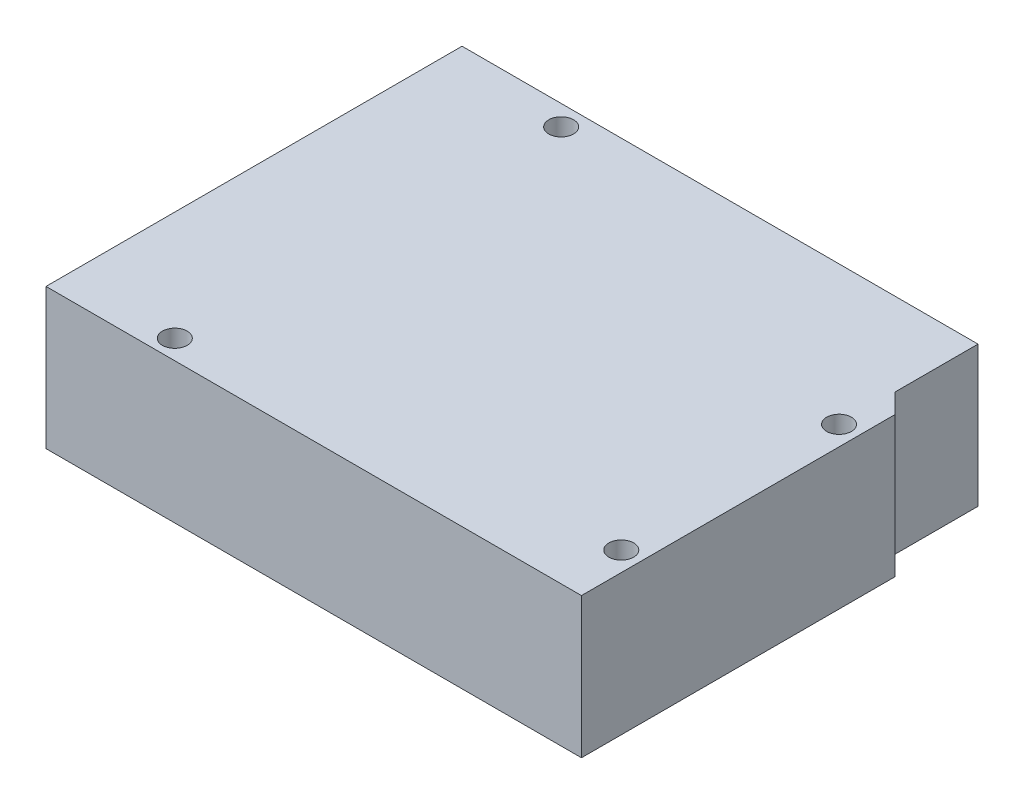
ISO-10303-21;
HEADER;
FILE_DESCRIPTION(('STEP AP214'),'2;1');
FILE_NAME('part.step','',(''),(''),'','','');
FILE_SCHEMA(('AUTOMOTIVE_DESIGN { 1 0 10303 214 1 1 1 1 }'));
ENDSEC;
DATA;
#1=APPLICATION_CONTEXT('core data for automotive mechanical design processes');
#2=APPLICATION_PROTOCOL_DEFINITION('international standard','automotive_design',2000,#1);
#3=PRODUCT_CONTEXT('',#1,'mechanical');
#4=PRODUCT('Part','Part','',(#3));
#5=PRODUCT_RELATED_PRODUCT_CATEGORY('part','',(#4));
#6=PRODUCT_DEFINITION_FORMATION('','',#4);
#7=PRODUCT_DEFINITION_CONTEXT('part definition',#1,'design');
#8=PRODUCT_DEFINITION('design','',#6,#7);
#9=PRODUCT_DEFINITION_SHAPE('','',#8);
#10=(LENGTH_UNIT() NAMED_UNIT(*) SI_UNIT(.MILLI.,.METRE.));
#11=(NAMED_UNIT(*) PLANE_ANGLE_UNIT() SI_UNIT($,.RADIAN.));
#12=(NAMED_UNIT(*) SI_UNIT($,.STERADIAN.) SOLID_ANGLE_UNIT());
#13=UNCERTAINTY_MEASURE_WITH_UNIT(LENGTH_MEASURE(1.E-05),#10,'distance_accuracy_value','');
#14=(GEOMETRIC_REPRESENTATION_CONTEXT(3) GLOBAL_UNCERTAINTY_ASSIGNED_CONTEXT((#13)) GLOBAL_UNIT_ASSIGNED_CONTEXT((#10,
#11,#12)) REPRESENTATION_CONTEXT('',''));
#15=CARTESIAN_POINT('',(0.,0.,0.));
#16=DIRECTION('',(0.,0.,1.));
#17=DIRECTION('',(1.,0.,0.));
#18=AXIS2_PLACEMENT_3D('',#15,#16,#17);
#19=CARTESIAN_POINT('',(23.9098531993526,18.,-23.9098531993528));
#20=DIRECTION('',(0.707106781186545,0.,-0.70710678118655));
#21=DIRECTION('',(-0.70710678118655,0.,-0.707106781186545));
#22=AXIS2_PLACEMENT_3D('',#19,#20,#21);
#23=PLANE('',#22);
#24=DIRECTION('',(0.70710678118655,0.,0.707106781186545));
#25=VECTOR('',#24,1.);
#26=CARTESIAN_POINT('',(23.9098531993526,0.,-23.9098531993528));
#27=LINE('',#26,#25);
#28=CARTESIAN_POINT('',(31.8,0.,-16.0197063987054));
#29=VERTEX_POINT('',#28);
#30=CARTESIAN_POINT('',(34.3,0.,-13.5197063987054));
#31=VERTEX_POINT('',#30);
#32=EDGE_CURVE('E135',#29,#31,#27,.T.);
#33=ORIENTED_EDGE('',*,*,#32,.F.);
#34=DIRECTION('',(0.,-1.,0.));
#35=VECTOR('',#34,1.);
#36=CARTESIAN_POINT('',(31.8,18.,-16.0197063987054));
#37=LINE('',#36,#35);
#38=CARTESIAN_POINT('',(31.8,18.,-16.0197063987054));
#39=VERTEX_POINT('',#38);
#40=EDGE_CURVE('E11',#39,#29,#37,.T.);
#41=ORIENTED_EDGE('',*,*,#40,.F.);
#42=DIRECTION('',(0.70710678118655,0.,0.707106781186545));
#43=VECTOR('',#42,1.);
#44=CARTESIAN_POINT('',(23.9098531993526,18.,-23.9098531993528));
#45=LINE('',#44,#43);
#46=CARTESIAN_POINT('',(34.3,18.,-13.5197063987054));
#47=VERTEX_POINT('',#46);
#48=EDGE_CURVE('E313',#39,#47,#45,.T.);
#49=ORIENTED_EDGE('',*,*,#48,.T.);
#50=DIRECTION('',(0.,-1.,0.));
#51=VECTOR('',#50,1.);
#52=CARTESIAN_POINT('',(34.3,18.,-13.5197063987054));
#53=LINE('',#52,#51);
#54=EDGE_CURVE('E58',#47,#31,#53,.T.);
#55=ORIENTED_EDGE('',*,*,#54,.T.);
#56=EDGE_LOOP('',(#33,#41,#49,#55));
#57=FACE_BOUND('',#56,.T.);
#58=ADVANCED_FACE('F41',(#57),#23,.T.);
#59=CARTESIAN_POINT('',(31.8,18.,0.));
#60=DIRECTION('',(1.,0.,0.));
#61=DIRECTION('',(0.,0.,-1.));
#62=AXIS2_PLACEMENT_3D('',#59,#60,#61);
#63=PLANE('',#62);
#64=DIRECTION('',(0.,0.,1.));
#65=VECTOR('',#64,1.);
#66=CARTESIAN_POINT('',(31.8,0.,0.));
#67=LINE('',#66,#65);
#68=CARTESIAN_POINT('',(31.8,0.,-26.65));
#69=VERTEX_POINT('',#68);
#70=EDGE_CURVE('E132',#69,#29,#67,.T.);
#71=ORIENTED_EDGE('',*,*,#70,.F.);
#72=DIRECTION('',(0.,-1.,0.));
#73=VECTOR('',#72,1.);
#74=CARTESIAN_POINT('',(31.8,18.,-26.65));
#75=LINE('',#74,#73);
#76=CARTESIAN_POINT('',(31.8,18.,-26.65));
#77=VERTEX_POINT('',#76);
#78=EDGE_CURVE('E50',#77,#69,#75,.T.);
#79=ORIENTED_EDGE('',*,*,#78,.F.);
#80=DIRECTION('',(0.,0.,1.));
#81=VECTOR('',#80,1.);
#82=CARTESIAN_POINT('',(31.8,18.,0.));
#83=LINE('',#82,#81);
#84=EDGE_CURVE('E315',#77,#39,#83,.T.);
#85=ORIENTED_EDGE('',*,*,#84,.T.);
#86=ORIENTED_EDGE('',*,*,#40,.T.);
#87=EDGE_LOOP('',(#71,#79,#85,#86));
#88=FACE_BOUND('',#87,.T.);
#89=ADVANCED_FACE('F133',(#88),#63,.T.);
#90=CARTESIAN_POINT('',(0.,18.,-26.65));
#91=DIRECTION('',(0.,0.,-1.));
#92=DIRECTION('',(-1.,0.,0.));
#93=AXIS2_PLACEMENT_3D('',#90,#91,#92);
#94=PLANE('',#93);
#95=DIRECTION('',(1.,0.,0.));
#96=VECTOR('',#95,1.);
#97=CARTESIAN_POINT('',(0.,0.,-26.65));
#98=LINE('',#97,#96);
#99=CARTESIAN_POINT('',(-34.3,0.,-26.65));
#100=VERTEX_POINT('',#99);
#101=EDGE_CURVE('E128',#100,#69,#98,.T.);
#102=ORIENTED_EDGE('',*,*,#101,.F.);
#103=DIRECTION('',(0.,-1.,0.));
#104=VECTOR('',#103,1.);
#105=CARTESIAN_POINT('',(-34.3,18.,-26.65));
#106=LINE('',#105,#104);
#107=CARTESIAN_POINT('',(-34.3,18.,-26.65));
#108=VERTEX_POINT('',#107);
#109=EDGE_CURVE('E118',#108,#100,#106,.T.);
#110=ORIENTED_EDGE('',*,*,#109,.F.);
#111=DIRECTION('',(1.,0.,0.));
#112=VECTOR('',#111,1.);
#113=CARTESIAN_POINT('',(0.,18.,-26.65));
#114=LINE('',#113,#112);
#115=EDGE_CURVE('E112',#108,#77,#114,.T.);
#116=ORIENTED_EDGE('',*,*,#115,.T.);
#117=ORIENTED_EDGE('',*,*,#78,.T.);
#118=EDGE_LOOP('',(#102,#110,#116,#117));
#119=FACE_BOUND('',#118,.T.);
#120=ADVANCED_FACE('F126',(#119),#94,.T.);
#121=CARTESIAN_POINT('',(-34.3,18.,0.));
#122=DIRECTION('',(1.,0.,0.));
#123=DIRECTION('',(0.,0.,-1.));
#124=AXIS2_PLACEMENT_3D('',#121,#122,#123);
#125=PLANE('',#124);
#126=DIRECTION('',(0.,0.,1.));
#127=VECTOR('',#126,1.);
#128=CARTESIAN_POINT('',(-34.3,0.,0.));
#129=LINE('',#128,#127);
#130=CARTESIAN_POINT('',(-34.3,0.,26.65));
#131=VERTEX_POINT('',#130);
#132=EDGE_CURVE('E117',#100,#131,#129,.T.);
#133=ORIENTED_EDGE('',*,*,#132,.T.);
#134=DIRECTION('',(0.,-1.,0.));
#135=VECTOR('',#134,1.);
#136=CARTESIAN_POINT('',(-34.3,18.,26.65));
#137=LINE('',#136,#135);
#138=CARTESIAN_POINT('',(-34.3,18.,26.65));
#139=VERTEX_POINT('',#138);
#140=EDGE_CURVE('E100',#139,#131,#137,.T.);
#141=ORIENTED_EDGE('',*,*,#140,.F.);
#142=DIRECTION('',(0.,0.,1.));
#143=VECTOR('',#142,1.);
#144=CARTESIAN_POINT('',(-34.3,18.,0.));
#145=LINE('',#144,#143);
#146=EDGE_CURVE('E105',#108,#139,#145,.T.);
#147=ORIENTED_EDGE('',*,*,#146,.F.);
#148=ORIENTED_EDGE('',*,*,#109,.T.);
#149=EDGE_LOOP('',(#133,#141,#147,#148));
#150=FACE_BOUND('',#149,.T.);
#151=ADVANCED_FACE('F115',(#150),#125,.F.);
#152=CARTESIAN_POINT('',(0.,18.,26.65));
#153=DIRECTION('',(0.,0.,-1.));
#154=DIRECTION('',(-1.,0.,0.));
#155=AXIS2_PLACEMENT_3D('',#152,#153,#154);
#156=PLANE('',#155);
#157=DIRECTION('',(1.,0.,0.));
#158=VECTOR('',#157,1.);
#159=CARTESIAN_POINT('',(0.,0.,26.65));
#160=LINE('',#159,#158);
#161=CARTESIAN_POINT('',(34.3,0.,26.65));
#162=VERTEX_POINT('',#161);
#163=EDGE_CURVE('E139',#131,#162,#160,.T.);
#164=ORIENTED_EDGE('',*,*,#163,.T.);
#165=DIRECTION('',(0.,-1.,0.));
#166=VECTOR('',#165,1.);
#167=CARTESIAN_POINT('',(34.3,18.,26.65));
#168=LINE('',#167,#166);
#169=CARTESIAN_POINT('',(34.3,18.,26.65));
#170=VERTEX_POINT('',#169);
#171=EDGE_CURVE('E78',#170,#162,#168,.T.);
#172=ORIENTED_EDGE('',*,*,#171,.F.);
#173=DIRECTION('',(1.,0.,0.));
#174=VECTOR('',#173,1.);
#175=CARTESIAN_POINT('',(0.,18.,26.65));
#176=LINE('',#175,#174);
#177=EDGE_CURVE('E96',#139,#170,#176,.T.);
#178=ORIENTED_EDGE('',*,*,#177,.F.);
#179=ORIENTED_EDGE('',*,*,#140,.T.);
#180=EDGE_LOOP('',(#164,#172,#178,#179));
#181=FACE_BOUND('',#180,.T.);
#182=ADVANCED_FACE('F98',(#181),#156,.F.);
#183=CARTESIAN_POINT('',(-20.3,18.,24.15));
#184=DIRECTION('',(0.,-1.,0.));
#185=DIRECTION('',(0.,0.,-1.));
#186=AXIS2_PLACEMENT_3D('',#183,#184,#185);
#187=CYLINDRICAL_SURFACE('',#186,1.5875);
#188=CARTESIAN_POINT('',(-20.3,18.,24.15));
#189=DIRECTION('',(0.,1.,0.));
#190=DIRECTION('',(0.,0.,1.));
#191=AXIS2_PLACEMENT_3D('',#188,#189,#190);
#192=CIRCLE('',#191,1.5875);
#193=CARTESIAN_POINT('',(-20.3,18.,25.7375));
#194=VERTEX_POINT('',#193);
#195=EDGE_CURVE('E306',#194,#194,#192,.T.);
#196=ORIENTED_EDGE('',*,*,#195,.T.);
#197=EDGE_LOOP('',(#196));
#198=FACE_BOUND('',#197,.T.);
#199=CARTESIAN_POINT('',(-20.3,0.,24.15));
#200=DIRECTION('',(0.,1.,0.));
#201=DIRECTION('',(0.,0.,1.));
#202=AXIS2_PLACEMENT_3D('',#199,#200,#201);
#203=CIRCLE('',#202,1.5875);
#204=CARTESIAN_POINT('',(-20.3,0.,25.7375));
#205=VERTEX_POINT('',#204);
#206=EDGE_CURVE('E158',#205,#205,#203,.T.);
#207=ORIENTED_EDGE('',*,*,#206,.F.);
#208=EDGE_LOOP('',(#207));
#209=FACE_BOUND('',#208,.T.);
#210=ADVANCED_FACE('F181',(#198,#209),#187,.F.);
#211=CARTESIAN_POINT('',(-19.,18.,-24.05));
#212=DIRECTION('',(0.,-1.,0.));
#213=DIRECTION('',(0.,0.,-1.));
#214=AXIS2_PLACEMENT_3D('',#211,#212,#213);
#215=CYLINDRICAL_SURFACE('',#214,1.5875);
#216=CARTESIAN_POINT('',(-19.,18.,-24.05));
#217=DIRECTION('',(0.,1.,0.));
#218=DIRECTION('',(0.,0.,1.));
#219=AXIS2_PLACEMENT_3D('',#216,#217,#218);
#220=CIRCLE('',#219,1.5875);
#221=CARTESIAN_POINT('',(-19.,18.,-22.4625));
#222=VERTEX_POINT('',#221);
#223=EDGE_CURVE('E303',#222,#222,#220,.T.);
#224=ORIENTED_EDGE('',*,*,#223,.T.);
#225=EDGE_LOOP('',(#224));
#226=FACE_BOUND('',#225,.T.);
#227=CARTESIAN_POINT('',(-19.,0.,-24.05));
#228=DIRECTION('',(0.,1.,0.));
#229=DIRECTION('',(0.,0.,1.));
#230=AXIS2_PLACEMENT_3D('',#227,#228,#229);
#231=CIRCLE('',#230,1.5875);
#232=CARTESIAN_POINT('',(-19.,0.,-22.4625));
#233=VERTEX_POINT('',#232);
#234=EDGE_CURVE('E155',#233,#233,#231,.T.);
#235=ORIENTED_EDGE('',*,*,#234,.F.);
#236=EDGE_LOOP('',(#235));
#237=FACE_BOUND('',#236,.T.);
#238=ADVANCED_FACE('F184',(#226,#237),#215,.F.);
#239=CARTESIAN_POINT('',(31.8,18.,19.05));
#240=DIRECTION('',(0.,-1.,0.));
#241=DIRECTION('',(0.,0.,-1.));
#242=AXIS2_PLACEMENT_3D('',#239,#240,#241);
#243=CYLINDRICAL_SURFACE('',#242,1.5875);
#244=CARTESIAN_POINT('',(31.8,18.,19.05));
#245=DIRECTION('',(0.,1.,0.));
#246=DIRECTION('',(0.,0.,1.));
#247=AXIS2_PLACEMENT_3D('',#244,#245,#246);
#248=CIRCLE('',#247,1.5875);
#249=CARTESIAN_POINT('',(31.8,18.,20.6375));
#250=VERTEX_POINT('',#249);
#251=EDGE_CURVE('E195',#250,#250,#248,.T.);
#252=ORIENTED_EDGE('',*,*,#251,.T.);
#253=EDGE_LOOP('',(#252));
#254=FACE_BOUND('',#253,.T.);
#255=CARTESIAN_POINT('',(31.8,0.,19.05));
#256=DIRECTION('',(0.,1.,0.));
#257=DIRECTION('',(0.,0.,1.));
#258=AXIS2_PLACEMENT_3D('',#255,#256,#257);
#259=CIRCLE('',#258,1.5875);
#260=CARTESIAN_POINT('',(31.8,0.,20.6375));
#261=VERTEX_POINT('',#260);
#262=EDGE_CURVE('E152',#261,#261,#259,.T.);
#263=ORIENTED_EDGE('',*,*,#262,.F.);
#264=EDGE_LOOP('',(#263));
#265=FACE_BOUND('',#264,.T.);
#266=ADVANCED_FACE('F169',(#254,#265),#243,.F.);
#267=CARTESIAN_POINT('',(31.8,18.,-8.85));
#268=DIRECTION('',(0.,-1.,0.));
#269=DIRECTION('',(0.,0.,-1.));
#270=AXIS2_PLACEMENT_3D('',#267,#268,#269);
#271=CYLINDRICAL_SURFACE('',#270,1.5875);
#272=CARTESIAN_POINT('',(31.8,18.,-8.85));
#273=DIRECTION('',(0.,1.,0.));
#274=DIRECTION('',(0.,0.,1.));
#275=AXIS2_PLACEMENT_3D('',#272,#273,#274);
#276=CIRCLE('',#275,1.5875);
#277=CARTESIAN_POINT('',(31.8,18.,-7.2625));
#278=VERTEX_POINT('',#277);
#279=EDGE_CURVE('E146',#278,#278,#276,.T.);
#280=ORIENTED_EDGE('',*,*,#279,.T.);
#281=EDGE_LOOP('',(#280));
#282=FACE_BOUND('',#281,.T.);
#283=CARTESIAN_POINT('',(31.8,0.,-8.85));
#284=DIRECTION('',(0.,1.,0.));
#285=DIRECTION('',(0.,0.,1.));
#286=AXIS2_PLACEMENT_3D('',#283,#284,#285);
#287=CIRCLE('',#286,1.5875);
#288=CARTESIAN_POINT('',(31.8,0.,-7.2625));
#289=VERTEX_POINT('',#288);
#290=EDGE_CURVE('E149',#289,#289,#287,.T.);
#291=ORIENTED_EDGE('',*,*,#290,.F.);
#292=EDGE_LOOP('',(#291));
#293=FACE_BOUND('',#292,.T.);
#294=ADVANCED_FACE('F43',(#282,#293),#271,.F.);
#295=CARTESIAN_POINT('',(34.3,18.,0.));
#296=DIRECTION('',(1.,0.,0.));
#297=DIRECTION('',(0.,0.,-1.));
#298=AXIS2_PLACEMENT_3D('',#295,#296,#297);
#299=PLANE('',#298);
#300=DIRECTION('',(0.,0.,1.));
#301=VECTOR('',#300,1.);
#302=CARTESIAN_POINT('',(34.3,0.,0.));
#303=LINE('',#302,#301);
#304=EDGE_CURVE('E144',#31,#162,#303,.T.);
#305=ORIENTED_EDGE('',*,*,#304,.F.);
#306=ORIENTED_EDGE('',*,*,#54,.F.);
#307=DIRECTION('',(0.,0.,1.));
#308=VECTOR('',#307,1.);
#309=CARTESIAN_POINT('',(34.3,18.,0.));
#310=LINE('',#309,#308);
#311=EDGE_CURVE('E104',#47,#170,#310,.T.);
#312=ORIENTED_EDGE('',*,*,#311,.T.);
#313=ORIENTED_EDGE('',*,*,#171,.T.);
#314=EDGE_LOOP('',(#305,#306,#312,#313));
#315=FACE_BOUND('',#314,.T.);
#316=ADVANCED_FACE('F160',(#315),#299,.T.);
#317=CARTESIAN_POINT('',(0.,18.,0.));
#318=DIRECTION('',(0.,1.,0.));
#319=DIRECTION('',(0.,0.,1.));
#320=AXIS2_PLACEMENT_3D('',#317,#318,#319);
#321=PLANE('',#320);
#322=ORIENTED_EDGE('',*,*,#279,.F.);
#323=EDGE_LOOP('',(#322));
#324=FACE_BOUND('',#323,.T.);
#325=ORIENTED_EDGE('',*,*,#251,.F.);
#326=EDGE_LOOP('',(#325));
#327=FACE_BOUND('',#326,.T.);
#328=ORIENTED_EDGE('',*,*,#223,.F.);
#329=EDGE_LOOP('',(#328));
#330=FACE_BOUND('',#329,.T.);
#331=ORIENTED_EDGE('',*,*,#195,.F.);
#332=EDGE_LOOP('',(#331));
#333=FACE_BOUND('',#332,.T.);
#334=ORIENTED_EDGE('',*,*,#48,.F.);
#335=ORIENTED_EDGE('',*,*,#84,.F.);
#336=ORIENTED_EDGE('',*,*,#115,.F.);
#337=ORIENTED_EDGE('',*,*,#146,.T.);
#338=ORIENTED_EDGE('',*,*,#177,.T.);
#339=ORIENTED_EDGE('',*,*,#311,.F.);
#340=EDGE_LOOP('',(#334,#335,#336,#337,#338,#339));
#341=FACE_BOUND('',#340,.T.);
#342=ADVANCED_FACE('F109',(#324,#327,#330,#333,#341),#321,.T.);
#343=CARTESIAN_POINT('',(0.,0.,0.));
#344=DIRECTION('',(0.,1.,0.));
#345=DIRECTION('',(0.,0.,1.));
#346=AXIS2_PLACEMENT_3D('',#343,#344,#345);
#347=PLANE('',#346);
#348=ORIENTED_EDGE('',*,*,#290,.T.);
#349=EDGE_LOOP('',(#348));
#350=FACE_BOUND('',#349,.T.);
#351=ORIENTED_EDGE('',*,*,#262,.T.);
#352=EDGE_LOOP('',(#351));
#353=FACE_BOUND('',#352,.T.);
#354=ORIENTED_EDGE('',*,*,#234,.T.);
#355=EDGE_LOOP('',(#354));
#356=FACE_BOUND('',#355,.T.);
#357=ORIENTED_EDGE('',*,*,#206,.T.);
#358=EDGE_LOOP('',(#357));
#359=FACE_BOUND('',#358,.T.);
#360=ORIENTED_EDGE('',*,*,#32,.T.);
#361=ORIENTED_EDGE('',*,*,#304,.T.);
#362=ORIENTED_EDGE('',*,*,#163,.F.);
#363=ORIENTED_EDGE('',*,*,#132,.F.);
#364=ORIENTED_EDGE('',*,*,#101,.T.);
#365=ORIENTED_EDGE('',*,*,#70,.T.);
#366=EDGE_LOOP('',(#360,#361,#362,#363,#364,#365));
#367=FACE_BOUND('',#366,.T.);
#368=ADVANCED_FACE('F137',(#350,#353,#356,#359,#367),#347,.F.);
#369=CLOSED_SHELL('',(#58,#89,#120,#151,#182,#210,#238,#266,#294,#316,#342,#368));
#370=MANIFOLD_SOLID_BREP('B2',#369);
#371=ADVANCED_BREP_SHAPE_REPRESENTATION('',(#18,#370),#14);
#372=SHAPE_DEFINITION_REPRESENTATION(#9,#371);
ENDSEC;
END-ISO-10303-21;
